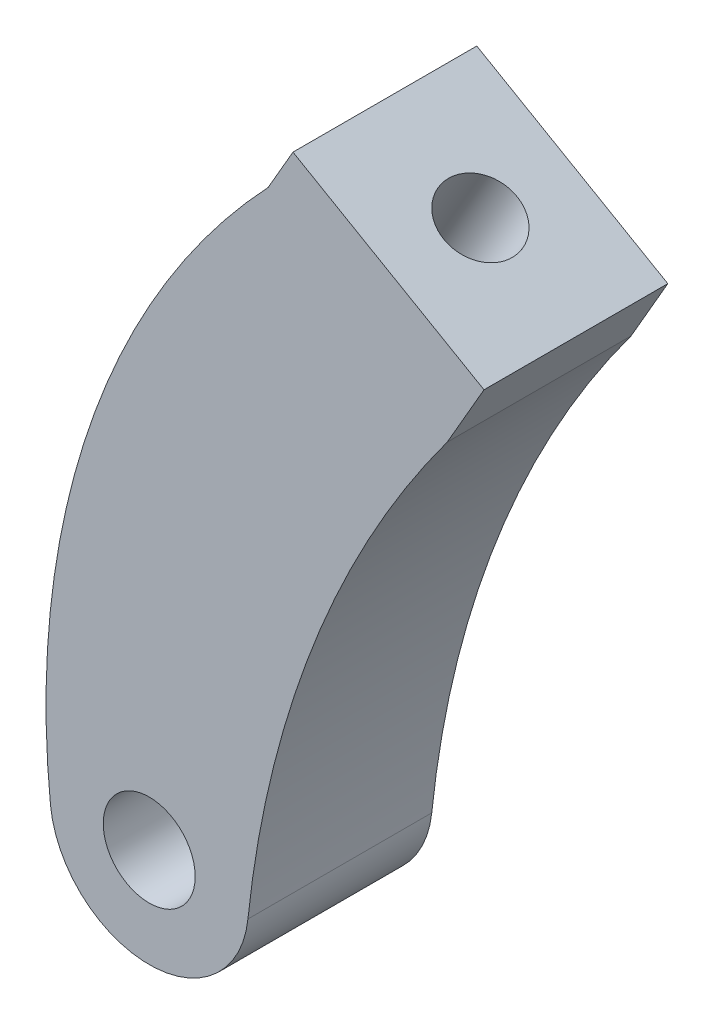
ISO-10303-21;
HEADER;
FILE_DESCRIPTION(('STEP AP214'),'2;1');
FILE_NAME('part.step','',(''),(''),'','','');
FILE_SCHEMA(('AUTOMOTIVE_DESIGN { 1 0 10303 214 1 1 1 1 }'));
ENDSEC;
DATA;
#1=APPLICATION_CONTEXT('core data for automotive mechanical design processes');
#2=APPLICATION_PROTOCOL_DEFINITION('international standard','automotive_design',2000,#1);
#3=PRODUCT_CONTEXT('',#1,'mechanical');
#4=PRODUCT('Part','Part','',(#3));
#5=PRODUCT_RELATED_PRODUCT_CATEGORY('part','',(#4));
#6=PRODUCT_DEFINITION_FORMATION('','',#4);
#7=PRODUCT_DEFINITION_CONTEXT('part definition',#1,'design');
#8=PRODUCT_DEFINITION('design','',#6,#7);
#9=PRODUCT_DEFINITION_SHAPE('','',#8);
#10=(LENGTH_UNIT() NAMED_UNIT(*) SI_UNIT(.MILLI.,.METRE.));
#11=(NAMED_UNIT(*) PLANE_ANGLE_UNIT() SI_UNIT($,.RADIAN.));
#12=(NAMED_UNIT(*) SI_UNIT($,.STERADIAN.) SOLID_ANGLE_UNIT());
#13=UNCERTAINTY_MEASURE_WITH_UNIT(LENGTH_MEASURE(1.E-05),#10,'distance_accuracy_value','');
#14=(GEOMETRIC_REPRESENTATION_CONTEXT(3) GLOBAL_UNCERTAINTY_ASSIGNED_CONTEXT((#13)) GLOBAL_UNIT_ASSIGNED_CONTEXT((#10,
#11,#12)) REPRESENTATION_CONTEXT('',''));
#15=CARTESIAN_POINT('',(0.,0.,0.));
#16=DIRECTION('',(0.,0.,1.));
#17=DIRECTION('',(1.,0.,0.));
#18=AXIS2_PLACEMENT_3D('',#15,#16,#17);
#19=CARTESIAN_POINT('',(93.869153376536,-102.394322585033,25.));
#20=DIRECTION('',(-0.500000000000001,-0.866025403784438,0.));
#21=DIRECTION('',(0.866025403784438,-0.500000000000001,0.));
#22=AXIS2_PLACEMENT_3D('',#19,#20,#21);
#23=PLANE('',#22);
#24=DIRECTION('',(-0.866025403784438,0.500000000000001,0.));
#25=VECTOR('',#24,1.);
#26=CARTESIAN_POINT('',(93.869153376536,-102.394322585033,-25.));
#27=LINE('',#26,#25);
#28=CARTESIAN_POINT('',(93.869153376536,-102.394322585033,-25.));
#29=VERTEX_POINT('',#28);
#30=CARTESIAN_POINT('',(41.9076291494697,-72.3943225850328,-25.));
#31=VERTEX_POINT('',#30);
#32=EDGE_CURVE('E76',#29,#31,#27,.T.);
#33=ORIENTED_EDGE('',*,*,#32,.T.);
#34=DIRECTION('',(0.,0.,-1.));
#35=VECTOR('',#34,1.);
#36=CARTESIAN_POINT('',(41.9076291494697,-72.3943225850328,25.));
#37=LINE('',#36,#35);
#38=CARTESIAN_POINT('',(41.9076291494697,-72.3943225850328,25.));
#39=VERTEX_POINT('',#38);
#40=EDGE_CURVE('E115',#39,#31,#37,.T.);
#41=ORIENTED_EDGE('',*,*,#40,.F.);
#42=DIRECTION('',(-0.866025403784438,0.500000000000001,0.));
#43=VECTOR('',#42,1.);
#44=CARTESIAN_POINT('',(93.869153376536,-102.394322585033,25.));
#45=LINE('',#44,#43);
#46=CARTESIAN_POINT('',(93.869153376536,-102.394322585033,25.));
#47=VERTEX_POINT('',#46);
#48=EDGE_CURVE('E103',#47,#39,#45,.T.);
#49=ORIENTED_EDGE('',*,*,#48,.F.);
#50=DIRECTION('',(0.,0.,-1.));
#51=VECTOR('',#50,1.);
#52=CARTESIAN_POINT('',(93.869153376536,-102.394322585033,25.));
#53=LINE('',#52,#51);
#54=EDGE_CURVE('E110',#47,#29,#53,.T.);
#55=ORIENTED_EDGE('',*,*,#54,.T.);
#56=EDGE_LOOP('',(#33,#41,#49,#55));
#57=FACE_BOUND('',#56,.T.);
#58=CARTESIAN_POINT('',(67.8883912630029,-87.3943225850329,0.));
#59=DIRECTION('',(0.500000000000001,0.866025403784438,0.));
#60=DIRECTION('',(-0.866025403784438,0.500000000000001,0.));
#61=AXIS2_PLACEMENT_3D('',#58,#59,#60);
#62=CIRCLE('',#61,10.);
#63=CARTESIAN_POINT('',(59.2281372251585,-82.3943225850329,0.));
#64=VERTEX_POINT('',#63);
#65=EDGE_CURVE('E191',#64,#64,#62,.T.);
#66=ORIENTED_EDGE('',*,*,#65,.F.);
#67=EDGE_LOOP('',(#66));
#68=FACE_BOUND('',#67,.T.);
#69=ADVANCED_FACE('F35',(#57,#68),#23,.F.);
#70=CARTESIAN_POINT('',(196.06451331363,-236.053533315727,25.));
#71=DIRECTION('',(0.,0.,1.));
#72=DIRECTION('',(1.,0.,0.));
#73=AXIS2_PLACEMENT_3D('',#70,#71,#72);
#74=PLANE('',#73);
#75=CARTESIAN_POINT('',(196.06451331363,-236.053533315727,25.));
#76=DIRECTION('',(0.,0.,1.));
#77=DIRECTION('',(1.,0.,0.));
#78=AXIS2_PLACEMENT_3D('',#75,#76,#77);
#79=CIRCLE('',#78,221.323373912599);
#80=CARTESIAN_POINT('',(35.1516545557071,-84.0960138360742,25.));
#81=VERTEX_POINT('',#80);
#82=CARTESIAN_POINT('',(-24.0484743005871,-259.168647929324,25.));
#83=VERTEX_POINT('',#82);
#84=EDGE_CURVE('E134',#81,#83,#79,.T.);
#85=ORIENTED_EDGE('',*,*,#84,.T.);
#86=CARTESIAN_POINT('',(2.80386650970061,-256.348755554045,25.));
#87=DIRECTION('',(0.,0.,1.));
#88=DIRECTION('',(1.,0.,0.));
#89=AXIS2_PLACEMENT_3D('',#86,#87,#88);
#90=CIRCLE('',#89,27.);
#91=CARTESIAN_POINT('',(29.6562073199883,-259.168647929324,25.));
#92=VERTEX_POINT('',#91);
#93=EDGE_CURVE('E90',#83,#92,#90,.T.);
#94=ORIENTED_EDGE('',*,*,#93,.T.);
#95=CARTESIAN_POINT('',(312.539817451353,-288.875604985195,25.));
#96=DIRECTION('',(0.,0.,-1.));
#97=DIRECTION('',(-1.,0.,0.));
#98=AXIS2_PLACEMENT_3D('',#95,#96,#97);
#99=CIRCLE('',#98,284.439167799502);
#100=CARTESIAN_POINT('',(83.869153376536,-119.714830660722,25.));
#101=VERTEX_POINT('',#100);
#102=EDGE_CURVE('E105',#92,#101,#99,.T.);
#103=ORIENTED_EDGE('',*,*,#102,.T.);
#104=DIRECTION('',(0.500000000000001,0.866025403784438,0.));
#105=VECTOR('',#104,1.);
#106=CARTESIAN_POINT('',(83.869153376536,-119.714830660722,25.));
#107=LINE('',#106,#105);
#108=EDGE_CURVE('E98',#101,#47,#107,.T.);
#109=ORIENTED_EDGE('',*,*,#108,.T.);
#110=ORIENTED_EDGE('',*,*,#48,.T.);
#111=DIRECTION('',(-0.500000000000001,-0.866025403784438,0.));
#112=VECTOR('',#111,1.);
#113=CARTESIAN_POINT('',(41.9076291494697,-72.3943225850328,25.));
#114=LINE('',#113,#112);
#115=EDGE_CURVE('E52',#39,#81,#114,.T.);
#116=ORIENTED_EDGE('',*,*,#115,.T.);
#117=EDGE_LOOP('',(#85,#94,#103,#109,#110,#116));
#118=FACE_BOUND('',#117,.T.);
#119=CARTESIAN_POINT('',(2.80386650970061,-256.348755554045,25.));
#120=DIRECTION('',(0.,0.,1.));
#121=DIRECTION('',(1.,0.,0.));
#122=AXIS2_PLACEMENT_3D('',#119,#120,#121);
#123=CIRCLE('',#122,12.5);
#124=CARTESIAN_POINT('',(15.3038665097006,-256.348755554045,25.));
#125=VERTEX_POINT('',#124);
#126=EDGE_CURVE('E127',#125,#125,#123,.T.);
#127=ORIENTED_EDGE('',*,*,#126,.F.);
#128=EDGE_LOOP('',(#127));
#129=FACE_BOUND('',#128,.T.);
#130=ADVANCED_FACE('F100',(#118,#129),#74,.T.);
#131=CARTESIAN_POINT('',(196.06451331363,-236.053533315727,-25.));
#132=DIRECTION('',(0.,0.,1.));
#133=DIRECTION('',(1.,0.,0.));
#134=AXIS2_PLACEMENT_3D('',#131,#132,#133);
#135=PLANE('',#134);
#136=CARTESIAN_POINT('',(196.06451331363,-236.053533315727,-25.));
#137=DIRECTION('',(0.,0.,1.));
#138=DIRECTION('',(1.,0.,0.));
#139=AXIS2_PLACEMENT_3D('',#136,#137,#138);
#140=CIRCLE('',#139,221.323373912599);
#141=CARTESIAN_POINT('',(35.1516545557071,-84.0960138360742,-25.));
#142=VERTEX_POINT('',#141);
#143=CARTESIAN_POINT('',(-24.0484743005871,-259.168647929324,-25.));
#144=VERTEX_POINT('',#143);
#145=EDGE_CURVE('E123',#142,#144,#140,.T.);
#146=ORIENTED_EDGE('',*,*,#145,.F.);
#147=DIRECTION('',(-0.500000000000001,-0.866025403784438,0.));
#148=VECTOR('',#147,1.);
#149=CARTESIAN_POINT('',(41.9076291494697,-72.3943225850328,-25.));
#150=LINE('',#149,#148);
#151=EDGE_CURVE('E82',#31,#142,#150,.T.);
#152=ORIENTED_EDGE('',*,*,#151,.F.);
#153=ORIENTED_EDGE('',*,*,#32,.F.);
#154=DIRECTION('',(0.500000000000001,0.866025403784438,0.));
#155=VECTOR('',#154,1.);
#156=CARTESIAN_POINT('',(83.869153376536,-119.714830660722,-25.));
#157=LINE('',#156,#155);
#158=CARTESIAN_POINT('',(83.869153376536,-119.714830660722,-25.));
#159=VERTEX_POINT('',#158);
#160=EDGE_CURVE('E113',#159,#29,#157,.T.);
#161=ORIENTED_EDGE('',*,*,#160,.F.);
#162=CARTESIAN_POINT('',(312.539817451353,-288.875604985195,-25.));
#163=DIRECTION('',(0.,0.,-1.));
#164=DIRECTION('',(-1.,0.,0.));
#165=AXIS2_PLACEMENT_3D('',#162,#163,#164);
#166=CIRCLE('',#165,284.439167799502);
#167=CARTESIAN_POINT('',(29.6562073199883,-259.168647929324,-25.));
#168=VERTEX_POINT('',#167);
#169=EDGE_CURVE('E129',#168,#159,#166,.T.);
#170=ORIENTED_EDGE('',*,*,#169,.F.);
#171=CARTESIAN_POINT('',(2.80386650970061,-256.348755554045,-25.));
#172=DIRECTION('',(0.,0.,1.));
#173=DIRECTION('',(1.,0.,0.));
#174=AXIS2_PLACEMENT_3D('',#171,#172,#173);
#175=CIRCLE('',#174,27.);
#176=EDGE_CURVE('E126',#144,#168,#175,.T.);
#177=ORIENTED_EDGE('',*,*,#176,.F.);
#178=EDGE_LOOP('',(#146,#152,#153,#161,#170,#177));
#179=FACE_BOUND('',#178,.T.);
#180=CARTESIAN_POINT('',(2.80386650970061,-256.348755554045,-25.));
#181=DIRECTION('',(0.,0.,1.));
#182=DIRECTION('',(1.,0.,0.));
#183=AXIS2_PLACEMENT_3D('',#180,#181,#182);
#184=CIRCLE('',#183,12.5);
#185=CARTESIAN_POINT('',(15.3038665097006,-256.348755554045,-25.));
#186=VERTEX_POINT('',#185);
#187=EDGE_CURVE('E195',#186,#186,#184,.T.);
#188=ORIENTED_EDGE('',*,*,#187,.T.);
#189=EDGE_LOOP('',(#188));
#190=FACE_BOUND('',#189,.T.);
#191=ADVANCED_FACE('F143',(#179,#190),#135,.F.);
#192=CARTESIAN_POINT('',(196.06451331363,-236.053533315727,25.));
#193=DIRECTION('',(0.,0.,-1.));
#194=DIRECTION('',(-1.,0.,0.));
#195=AXIS2_PLACEMENT_3D('',#192,#193,#194);
#196=CYLINDRICAL_SURFACE('',#195,221.323373912599);
#197=ORIENTED_EDGE('',*,*,#145,.T.);
#198=DIRECTION('',(0.,0.,-1.));
#199=VECTOR('',#198,1.);
#200=CARTESIAN_POINT('',(-24.0484743005871,-259.168647929324,25.));
#201=LINE('',#200,#199);
#202=EDGE_CURVE('E11',#83,#144,#201,.T.);
#203=ORIENTED_EDGE('',*,*,#202,.F.);
#204=ORIENTED_EDGE('',*,*,#84,.F.);
#205=DIRECTION('',(0.,0.,-1.));
#206=VECTOR('',#205,1.);
#207=CARTESIAN_POINT('',(35.1516545557071,-84.0960138360742,25.));
#208=LINE('',#207,#206);
#209=EDGE_CURVE('E119',#81,#142,#208,.T.);
#210=ORIENTED_EDGE('',*,*,#209,.T.);
#211=EDGE_LOOP('',(#197,#203,#204,#210));
#212=FACE_BOUND('',#211,.T.);
#213=ADVANCED_FACE('F37',(#212),#196,.T.);
#214=CARTESIAN_POINT('',(2.80386650970061,-256.348755554045,25.));
#215=DIRECTION('',(0.,0.,-1.));
#216=DIRECTION('',(-1.,0.,0.));
#217=AXIS2_PLACEMENT_3D('',#214,#215,#216);
#218=CYLINDRICAL_SURFACE('',#217,27.);
#219=ORIENTED_EDGE('',*,*,#176,.T.);
#220=DIRECTION('',(0.,0.,-1.));
#221=VECTOR('',#220,1.);
#222=CARTESIAN_POINT('',(29.6562073199883,-259.168647929324,25.));
#223=LINE('',#222,#221);
#224=EDGE_CURVE('E44',#92,#168,#223,.T.);
#225=ORIENTED_EDGE('',*,*,#224,.F.);
#226=ORIENTED_EDGE('',*,*,#93,.F.);
#227=ORIENTED_EDGE('',*,*,#202,.T.);
#228=EDGE_LOOP('',(#219,#225,#226,#227));
#229=FACE_BOUND('',#228,.T.);
#230=ADVANCED_FACE('F169',(#229),#218,.T.);
#231=CARTESIAN_POINT('',(312.539817451353,-288.875604985195,25.));
#232=DIRECTION('',(0.,0.,-1.));
#233=DIRECTION('',(-1.,0.,0.));
#234=AXIS2_PLACEMENT_3D('',#231,#232,#233);
#235=CYLINDRICAL_SURFACE('',#234,284.439167799502);
#236=ORIENTED_EDGE('',*,*,#169,.T.);
#237=DIRECTION('',(0.,0.,-1.));
#238=VECTOR('',#237,1.);
#239=CARTESIAN_POINT('',(83.869153376536,-119.714830660722,25.));
#240=LINE('',#239,#238);
#241=EDGE_CURVE('E114',#101,#159,#240,.T.);
#242=ORIENTED_EDGE('',*,*,#241,.F.);
#243=ORIENTED_EDGE('',*,*,#102,.F.);
#244=ORIENTED_EDGE('',*,*,#224,.T.);
#245=EDGE_LOOP('',(#236,#242,#243,#244));
#246=FACE_BOUND('',#245,.T.);
#247=ADVANCED_FACE('F140',(#246),#235,.F.);
#248=CARTESIAN_POINT('',(83.869153376536,-119.714830660722,25.));
#249=DIRECTION('',(-0.866025403784438,0.500000000000001,0.));
#250=DIRECTION('',(-0.500000000000001,-0.866025403784438,0.));
#251=AXIS2_PLACEMENT_3D('',#248,#249,#250);
#252=PLANE('',#251);
#253=ORIENTED_EDGE('',*,*,#160,.T.);
#254=ORIENTED_EDGE('',*,*,#54,.F.);
#255=ORIENTED_EDGE('',*,*,#108,.F.);
#256=ORIENTED_EDGE('',*,*,#241,.T.);
#257=EDGE_LOOP('',(#253,#254,#255,#256));
#258=FACE_BOUND('',#257,.T.);
#259=ADVANCED_FACE('F111',(#258),#252,.F.);
#260=CARTESIAN_POINT('',(41.9076291494697,-72.3943225850328,25.));
#261=DIRECTION('',(0.866025403784438,-0.500000000000001,0.));
#262=DIRECTION('',(0.500000000000001,0.866025403784438,0.));
#263=AXIS2_PLACEMENT_3D('',#260,#261,#262);
#264=PLANE('',#263);
#265=ORIENTED_EDGE('',*,*,#151,.T.);
#266=ORIENTED_EDGE('',*,*,#209,.F.);
#267=ORIENTED_EDGE('',*,*,#115,.F.);
#268=ORIENTED_EDGE('',*,*,#40,.T.);
#269=EDGE_LOOP('',(#265,#266,#267,#268));
#270=FACE_BOUND('',#269,.T.);
#271=ADVANCED_FACE('F148',(#270),#264,.F.);
#272=CARTESIAN_POINT('',(2.80386650970061,-256.348755554045,25.));
#273=DIRECTION('',(0.,0.,-1.));
#274=DIRECTION('',(-1.,0.,0.));
#275=AXIS2_PLACEMENT_3D('',#272,#273,#274);
#276=CYLINDRICAL_SURFACE('',#275,12.5);
#277=ORIENTED_EDGE('',*,*,#126,.T.);
#278=EDGE_LOOP('',(#277));
#279=FACE_BOUND('',#278,.T.);
#280=ORIENTED_EDGE('',*,*,#187,.F.);
#281=EDGE_LOOP('',(#280));
#282=FACE_BOUND('',#281,.T.);
#283=ADVANCED_FACE('F150',(#279,#282),#276,.F.);
#284=CARTESIAN_POINT('',(50.3883912630028,-117.705211717488,0.));
#285=DIRECTION('',(0.500000000000001,0.866025403784438,0.));
#286=DIRECTION('',(-0.866025403784438,0.500000000000001,0.));
#287=AXIS2_PLACEMENT_3D('',#284,#285,#286);
#288=CONICAL_SURFACE('',#287,0.,1.04719755119659);
#289=CARTESIAN_POINT('',(53.275142608951,-112.705211717488,0.));
#290=DIRECTION('',(0.500000000000001,0.866025403784438,0.));
#291=DIRECTION('',(-0.866025403784438,0.500000000000001,0.));
#292=AXIS2_PLACEMENT_3D('',#289,#290,#291);
#293=CIRCLE('',#292,9.99999999999999);
#294=CARTESIAN_POINT('',(44.6148885711066,-107.705211717488,0.));
#295=VERTEX_POINT('',#294);
#296=EDGE_CURVE('E194',#295,#295,#293,.T.);
#297=ORIENTED_EDGE('',*,*,#296,.T.);
#298=EDGE_LOOP('',(#297));
#299=FACE_BOUND('',#298,.T.);
#300=CARTESIAN_POINT('',(50.3883912630028,-117.705211717488,0.));
#301=VERTEX_POINT('',#300);
#302=VERTEX_LOOP('',#301);
#303=FACE_BOUND('',#302,.T.);
#304=ADVANCED_FACE('F156',(#299,#303),#288,.F.);
#305=CARTESIAN_POINT('',(67.8883912630029,-87.3943225850329,0.));
#306=DIRECTION('',(0.500000000000001,0.866025403784438,0.));
#307=DIRECTION('',(-0.866025403784438,0.500000000000001,0.));
#308=AXIS2_PLACEMENT_3D('',#305,#306,#307);
#309=CYLINDRICAL_SURFACE('',#308,10.);
#310=CARTESIAN_POINT('',(59.2281372251585,-82.3943225850329,0.));
#311=CARTESIAN_POINT('',(59.0759158850121,-82.6579776801626,0.));
#312=CARTESIAN_POINT('',(58.9236945448657,-82.9216327752923,0.));
#313=CARTESIAN_POINT('',(58.619251864573,-83.4489429655518,0.));
#314=CARTESIAN_POINT('',(58.4670305244266,-83.7125980606816,0.));
#315=CARTESIAN_POINT('',(58.1625878441339,-84.239908250941,0.));
#316=CARTESIAN_POINT('',(58.0103665039875,-84.5035633460708,0.));
#317=CARTESIAN_POINT('',(57.7059238236948,-85.0308735363303,0.));
#318=CARTESIAN_POINT('',(57.5537024835484,-85.29452863146,0.));
#319=CARTESIAN_POINT('',(57.2492598032556,-85.8218388217195,0.));
#320=CARTESIAN_POINT('',(57.0970384631093,-86.0854939168492,0.));
#321=CARTESIAN_POINT('',(56.7925957828165,-86.6128041071087,0.));
#322=CARTESIAN_POINT('',(56.6403744426701,-86.8764592022385,0.));
#323=CARTESIAN_POINT('',(56.3359317623774,-87.403769392498,0.));
#324=CARTESIAN_POINT('',(56.183710422231,-87.6674244876277,0.));
#325=CARTESIAN_POINT('',(55.8792677419383,-88.1947346778872,0.));
#326=CARTESIAN_POINT('',(55.7270464017919,-88.4583897730169,0.));
#327=CARTESIAN_POINT('',(55.4226037214992,-88.9856999632764,0.));
#328=CARTESIAN_POINT('',(55.2703823813528,-89.2493550584062,0.));
#329=CARTESIAN_POINT('',(54.96593970106,-89.7766652486656,0.));
#330=CARTESIAN_POINT('',(54.8137183609137,-90.0403203437954,0.));
#331=CARTESIAN_POINT('',(54.5092756806209,-90.5676305340549,0.));
#332=CARTESIAN_POINT('',(54.3570543404745,-90.8312856291846,0.));
#333=CARTESIAN_POINT('',(54.0526116601818,-91.3585958194441,0.));
#334=CARTESIAN_POINT('',(53.9003903200354,-91.6222509145738,0.));
#335=CARTESIAN_POINT('',(53.5959476397427,-92.1495611048333,0.));
#336=CARTESIAN_POINT('',(53.4437262995963,-92.4132161999631,0.));
#337=CARTESIAN_POINT('',(53.1392836193036,-92.9405263902225,0.));
#338=CARTESIAN_POINT('',(52.9870622791572,-93.2041814853523,0.));
#339=CARTESIAN_POINT('',(52.6826195988644,-93.7314916756118,0.));
#340=CARTESIAN_POINT('',(52.5303982587181,-93.9951467707415,0.));
#341=CARTESIAN_POINT('',(52.2259555784253,-94.522456961001,0.));
#342=CARTESIAN_POINT('',(52.0737342382789,-94.7861120561307,0.));
#343=CARTESIAN_POINT('',(51.7692915579862,-95.3134222463902,0.));
#344=CARTESIAN_POINT('',(51.6170702178398,-95.57707734152,0.));
#345=CARTESIAN_POINT('',(51.3126275375471,-96.1043875317795,0.));
#346=CARTESIAN_POINT('',(51.1604061974007,-96.3680426269092,0.));
#347=CARTESIAN_POINT('',(50.855963517108,-96.8953528171687,0.));
#348=CARTESIAN_POINT('',(50.7037421769616,-97.1590079122984,0.));
#349=CARTESIAN_POINT('',(50.3992994966688,-97.6863181025579,0.));
#350=CARTESIAN_POINT('',(50.2470781565224,-97.9499731976877,0.));
#351=CARTESIAN_POINT('',(49.9426354762297,-98.4772833879471,0.));
#352=CARTESIAN_POINT('',(49.7904141360833,-98.7409384830769,0.));
#353=CARTESIAN_POINT('',(49.4859714557906,-99.2682486733364,0.));
#354=CARTESIAN_POINT('',(49.3337501156442,-99.5319037684661,0.));
#355=CARTESIAN_POINT('',(49.0293074353515,-100.059213958726,0.));
#356=CARTESIAN_POINT('',(48.8770860952051,-100.322869053855,0.));
#357=CARTESIAN_POINT('',(48.5726434149123,-100.850179244115,0.));
#358=CARTESIAN_POINT('',(48.420422074766,-101.113834339245,0.));
#359=CARTESIAN_POINT('',(48.1159793944732,-101.641144529504,0.));
#360=CARTESIAN_POINT('',(47.9637580543268,-101.904799624634,0.));
#361=CARTESIAN_POINT('',(47.6593153740341,-102.432109814893,0.));
#362=CARTESIAN_POINT('',(47.5070940338877,-102.695764910023,0.));
#363=CARTESIAN_POINT('',(47.202651353595,-103.223075100282,0.));
#364=CARTESIAN_POINT('',(47.0504300134486,-103.486730195412,0.));
#365=CARTESIAN_POINT('',(46.7459873331559,-104.014040385672,0.));
#366=CARTESIAN_POINT('',(46.5937659930095,-104.277695480801,0.));
#367=CARTESIAN_POINT('',(46.2893233127167,-104.805005671061,0.));
#368=CARTESIAN_POINT('',(46.1371019725704,-105.068660766191,0.));
#369=CARTESIAN_POINT('',(45.8326592922776,-105.59597095645,0.));
#370=CARTESIAN_POINT('',(45.6804379521312,-105.85962605158,0.));
#371=CARTESIAN_POINT('',(45.3759952718385,-106.386936241839,0.));
#372=CARTESIAN_POINT('',(45.2237739316921,-106.650591336969,0.));
#373=CARTESIAN_POINT('',(44.9193312513994,-107.177901527229,0.));
#374=CARTESIAN_POINT('',(44.767109911253,-107.441556622358,0.));
#375=CARTESIAN_POINT('',(44.6148885711066,-107.705211717488,0.));
#376=B_SPLINE_CURVE_WITH_KNOTS('',3,(#310,#311,#312,#313,#314,#315,#316,#317,#318,#319,#320,
#321,#322,#323,#324,#325,#326,#327,#328,#329,#330,#331,#332,#333,#334,#335,#336,#337,#338,#339,
#340,#341,#342,#343,#344,#345,#346,#347,#348,#349,#350,#351,#352,#353,#354,#355,#356,#357,#358,
#359,#360,#361,#362,#363,#364,#365,#366,#367,#368,#369,#370,#371,#372,#373,#374,#375),
.UNSPECIFIED.,.F.,.F.,(4,2,2,2,2,2,2,2,2,2,2,2,2,2,2,2,2,2,2,2,2,2,2,2,2,2,2,2,2,2,2,2,4),(0.,
0.913328040878241,1.82665608175648,2.73998412263472,3.65331216351296,4.5666402043912,
5.47996824526944,6.39329628614767,7.30662432702592,8.21995236790416,9.1332804087824,
10.0466084496606,10.9599364905389,11.8732645314171,12.7865925722953,13.6999206131736,
14.6132486540518,15.5265766949301,16.4399047358083,17.3532327766865,18.2665608175648,
19.179888858443,20.0932168993213,21.0065449401995,21.9198729810777,22.833201021956,
23.7465290628342,24.6598571037125,25.5731851445907,26.4865131854689,27.3998412263472,
28.3131692672254,29.2264973081037),.UNSPECIFIED.);
#377=EDGE_CURVE('BSEAM182',#64,#295,#376,.T.);
#378=ORIENTED_EDGE('',*,*,#65,.T.);
#379=ORIENTED_EDGE('',*,*,#296,.F.);
#380=ORIENTED_EDGE('',*,*,#377,.T.);
#381=ORIENTED_EDGE('',*,*,#377,.F.);
#382=EDGE_LOOP('',(#378,#380,#379,#381));
#383=FACE_BOUND('',#382,.T.);
#384=ADVANCED_FACE('F182',(#383),#309,.F.);
#385=CLOSED_SHELL('',(#69,#130,#191,#213,#230,#247,#259,#271,#283,#304,#384));
#386=MANIFOLD_SOLID_BREP('B2',#385);
#387=ADVANCED_BREP_SHAPE_REPRESENTATION('',(#18,#386),#14);
#388=SHAPE_DEFINITION_REPRESENTATION(#9,#387);
ENDSEC;
END-ISO-10303-21;
